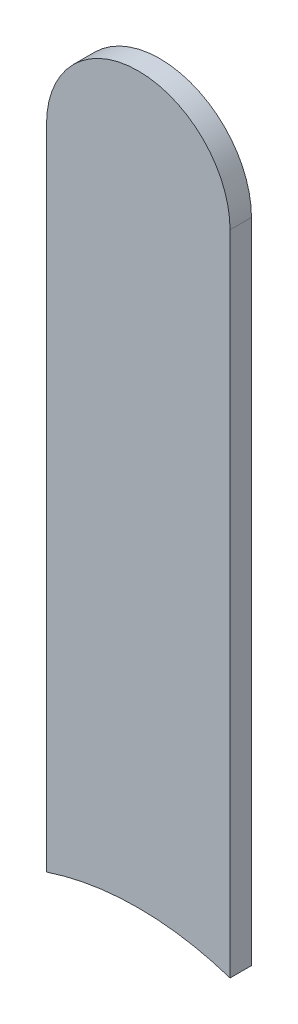
ISO-10303-21;
HEADER;
FILE_DESCRIPTION(('STEP AP214'),'2;1');
FILE_NAME('part.step','',(''),(''),'','','');
FILE_SCHEMA(('AUTOMOTIVE_DESIGN { 1 0 10303 214 1 1 1 1 }'));
ENDSEC;
DATA;
#1=APPLICATION_CONTEXT('core data for automotive mechanical design processes');
#2=APPLICATION_PROTOCOL_DEFINITION('international standard','automotive_design',2000,#1);
#3=PRODUCT_CONTEXT('',#1,'mechanical');
#4=PRODUCT('Part','Part','',(#3));
#5=PRODUCT_RELATED_PRODUCT_CATEGORY('part','',(#4));
#6=PRODUCT_DEFINITION_FORMATION('','',#4);
#7=PRODUCT_DEFINITION_CONTEXT('part definition',#1,'design');
#8=PRODUCT_DEFINITION('design','',#6,#7);
#9=PRODUCT_DEFINITION_SHAPE('','',#8);
#10=(LENGTH_UNIT() NAMED_UNIT(*) SI_UNIT(.MILLI.,.METRE.));
#11=(NAMED_UNIT(*) PLANE_ANGLE_UNIT() SI_UNIT($,.RADIAN.));
#12=(NAMED_UNIT(*) SI_UNIT($,.STERADIAN.) SOLID_ANGLE_UNIT());
#13=UNCERTAINTY_MEASURE_WITH_UNIT(LENGTH_MEASURE(1.E-05),#10,'distance_accuracy_value','');
#14=(GEOMETRIC_REPRESENTATION_CONTEXT(3) GLOBAL_UNCERTAINTY_ASSIGNED_CONTEXT((#13)) GLOBAL_UNIT_ASSIGNED_CONTEXT((#10,
#11,#12)) REPRESENTATION_CONTEXT('',''));
#15=CARTESIAN_POINT('',(0.,0.,0.));
#16=DIRECTION('',(0.,0.,1.));
#17=DIRECTION('',(1.,0.,0.));
#18=AXIS2_PLACEMENT_3D('',#15,#16,#17);
#19=CARTESIAN_POINT('',(134.,-48.69,1.6));
#20=DIRECTION('',(-1.,0.,0.));
#21=DIRECTION('',(0.,0.,1.));
#22=AXIS2_PLACEMENT_3D('',#19,#20,#21);
#23=PLANE('',#22);
#24=DIRECTION('',(0.,0.,1.));
#25=VECTOR('',#24,1.);
#26=CARTESIAN_POINT('',(134.,-47.18,1.6));
#27=LINE('',#26,#25);
#28=CARTESIAN_POINT('',(134.,-47.18,1.6));
#29=VERTEX_POINT('',#28);
#30=CARTESIAN_POINT('',(134.,-47.18,1.635));
#31=VERTEX_POINT('',#30);
#32=EDGE_CURVE('E11',#29,#31,#27,.T.);
#33=ORIENTED_EDGE('',*,*,#32,.T.);
#34=DIRECTION('',(0.,1.,0.));
#35=VECTOR('',#34,1.);
#36=CARTESIAN_POINT('',(134.,-48.69,1.635));
#37=LINE('',#36,#35);
#38=CARTESIAN_POINT('',(134.,-48.23930609056,1.635));
#39=VERTEX_POINT('',#38);
#40=EDGE_CURVE('E27',#39,#31,#37,.T.);
#41=ORIENTED_EDGE('',*,*,#40,.F.);
#42=DIRECTION('',(0.,0.,-1.));
#43=VECTOR('',#42,1.);
#44=CARTESIAN_POINT('',(134.,-48.23930609056,-0.045));
#45=LINE('',#44,#43);
#46=CARTESIAN_POINT('',(134.,-48.23930609056,1.6));
#47=VERTEX_POINT('',#46);
#48=EDGE_CURVE('E78',#39,#47,#45,.T.);
#49=ORIENTED_EDGE('',*,*,#48,.T.);
#50=DIRECTION('',(0.,1.,0.));
#51=VECTOR('',#50,1.);
#52=CARTESIAN_POINT('',(134.,-48.69,1.6));
#53=LINE('',#52,#51);
#54=EDGE_CURVE('E102',#47,#29,#53,.T.);
#55=ORIENTED_EDGE('',*,*,#54,.T.);
#56=EDGE_LOOP('',(#33,#41,#49,#55));
#57=FACE_BOUND('',#56,.T.);
#58=ADVANCED_FACE('F17',(#57),#23,.F.);
#59=CARTESIAN_POINT('',(133.85,-47.18,1.6));
#60=DIRECTION('',(0.,0.,-1.));
#61=DIRECTION('',(1.,1.894780628694E-13,0.));
#62=AXIS2_PLACEMENT_3D('',#59,#60,#61);
#63=CYLINDRICAL_SURFACE('',#62,0.15);
#64=CARTESIAN_POINT('',(133.85,-47.18,1.6));
#65=DIRECTION('',(0.,0.,1.));
#66=DIRECTION('',(1.,1.894780628694E-13,0.));
#67=AXIS2_PLACEMENT_3D('',#64,#65,#66);
#68=CIRCLE('',#67,0.15);
#69=CARTESIAN_POINT('',(133.7,-47.18,1.6));
#70=VERTEX_POINT('',#69);
#71=EDGE_CURVE('E82',#29,#70,#68,.T.);
#72=ORIENTED_EDGE('',*,*,#71,.T.);
#73=DIRECTION('',(0.,0.,1.));
#74=VECTOR('',#73,1.);
#75=CARTESIAN_POINT('',(133.7,-47.18,1.6));
#76=LINE('',#75,#74);
#77=CARTESIAN_POINT('',(133.7,-47.18,1.635));
#78=VERTEX_POINT('',#77);
#79=EDGE_CURVE('E80',#70,#78,#76,.T.);
#80=ORIENTED_EDGE('',*,*,#79,.T.);
#81=CARTESIAN_POINT('',(133.85,-47.18,1.635));
#82=DIRECTION('',(0.,0.,1.));
#83=DIRECTION('',(1.,1.894780628694E-13,0.));
#84=AXIS2_PLACEMENT_3D('',#81,#82,#83);
#85=CIRCLE('',#84,0.15);
#86=EDGE_CURVE('E21',#31,#78,#85,.T.);
#87=ORIENTED_EDGE('',*,*,#86,.F.);
#88=ORIENTED_EDGE('',*,*,#32,.F.);
#89=EDGE_LOOP('',(#72,#80,#87,#88));
#90=FACE_BOUND('',#89,.T.);
#91=ADVANCED_FACE('F19',(#90),#63,.T.);
#92=CARTESIAN_POINT('',(133.7,-47.18,1.635));
#93=DIRECTION('',(0.,0.,1.));
#94=DIRECTION('',(1.,0.,0.));
#95=AXIS2_PLACEMENT_3D('',#92,#93,#94);
#96=PLANE('',#95);
#97=ORIENTED_EDGE('',*,*,#86,.T.);
#98=DIRECTION('',(0.,-1.,0.));
#99=VECTOR('',#98,1.);
#100=CARTESIAN_POINT('',(133.7,-47.18,1.635));
#101=LINE('',#100,#99);
#102=CARTESIAN_POINT('',(133.7,-48.23930609056,1.635));
#103=VERTEX_POINT('',#102);
#104=EDGE_CURVE('E74',#78,#103,#101,.T.);
#105=ORIENTED_EDGE('',*,*,#104,.T.);
#106=CARTESIAN_POINT('',(133.85,-48.69,1.635));
#107=DIRECTION('',(0.,0.,-1.));
#108=DIRECTION('',(0.,-1.,0.));
#109=AXIS2_PLACEMENT_3D('',#106,#107,#108);
#110=CIRCLE('',#109,0.475);
#111=EDGE_CURVE('E111',#103,#39,#110,.T.);
#112=ORIENTED_EDGE('',*,*,#111,.T.);
#113=ORIENTED_EDGE('',*,*,#40,.T.);
#114=EDGE_LOOP('',(#97,#105,#112,#113));
#115=FACE_BOUND('',#114,.T.);
#116=ADVANCED_FACE('F71',(#115),#96,.T.);
#117=CARTESIAN_POINT('',(133.85,-48.69,-0.045));
#118=DIRECTION('',(0.,0.,-1.));
#119=DIRECTION('',(0.,-1.,0.));
#120=AXIS2_PLACEMENT_3D('',#117,#118,#119);
#121=CYLINDRICAL_SURFACE('',#120,0.475);
#122=ORIENTED_EDGE('',*,*,#111,.F.);
#123=DIRECTION('',(0.,0.,-1.));
#124=VECTOR('',#123,1.);
#125=CARTESIAN_POINT('',(133.7,-48.23930609056,-0.045));
#126=LINE('',#125,#124);
#127=CARTESIAN_POINT('',(133.7,-48.23930609056,1.6));
#128=VERTEX_POINT('',#127);
#129=EDGE_CURVE('E91',#103,#128,#126,.T.);
#130=ORIENTED_EDGE('',*,*,#129,.T.);
#131=CARTESIAN_POINT('',(133.85,-48.69,1.6));
#132=DIRECTION('',(0.,0.,-1.));
#133=DIRECTION('',(0.,-1.,0.));
#134=AXIS2_PLACEMENT_3D('',#131,#132,#133);
#135=CIRCLE('',#134,0.475);
#136=EDGE_CURVE('E105',#128,#47,#135,.T.);
#137=ORIENTED_EDGE('',*,*,#136,.T.);
#138=ORIENTED_EDGE('',*,*,#48,.F.);
#139=EDGE_LOOP('',(#122,#130,#137,#138));
#140=FACE_BOUND('',#139,.T.);
#141=ADVANCED_FACE('F119',(#140),#121,.F.);
#142=CARTESIAN_POINT('',(133.7,-47.18,1.6));
#143=DIRECTION('',(0.,0.,1.));
#144=DIRECTION('',(1.,0.,0.));
#145=AXIS2_PLACEMENT_3D('',#142,#143,#144);
#146=PLANE('',#145);
#147=ORIENTED_EDGE('',*,*,#54,.F.);
#148=ORIENTED_EDGE('',*,*,#136,.F.);
#149=DIRECTION('',(0.,-1.,0.));
#150=VECTOR('',#149,1.);
#151=CARTESIAN_POINT('',(133.7,-47.18,1.6));
#152=LINE('',#151,#150);
#153=EDGE_CURVE('E87',#70,#128,#152,.T.);
#154=ORIENTED_EDGE('',*,*,#153,.F.);
#155=ORIENTED_EDGE('',*,*,#71,.F.);
#156=EDGE_LOOP('',(#147,#148,#154,#155));
#157=FACE_BOUND('',#156,.T.);
#158=ADVANCED_FACE('F122',(#157),#146,.F.);
#159=CARTESIAN_POINT('',(133.7,-47.18,1.6));
#160=DIRECTION('',(1.,0.,0.));
#161=DIRECTION('',(0.,1.,0.));
#162=AXIS2_PLACEMENT_3D('',#159,#160,#161);
#163=PLANE('',#162);
#164=ORIENTED_EDGE('',*,*,#129,.F.);
#165=ORIENTED_EDGE('',*,*,#104,.F.);
#166=ORIENTED_EDGE('',*,*,#79,.F.);
#167=ORIENTED_EDGE('',*,*,#153,.T.);
#168=EDGE_LOOP('',(#164,#165,#166,#167));
#169=FACE_BOUND('',#168,.T.);
#170=ADVANCED_FACE('F89',(#169),#163,.F.);
#171=CLOSED_SHELL('',(#58,#91,#116,#141,#158,#170));
#172=MANIFOLD_SOLID_BREP('B1',#171);
#173=ADVANCED_BREP_SHAPE_REPRESENTATION('',(#18,#172),#14);
#174=SHAPE_DEFINITION_REPRESENTATION(#9,#173);
ENDSEC;
END-ISO-10303-21;
